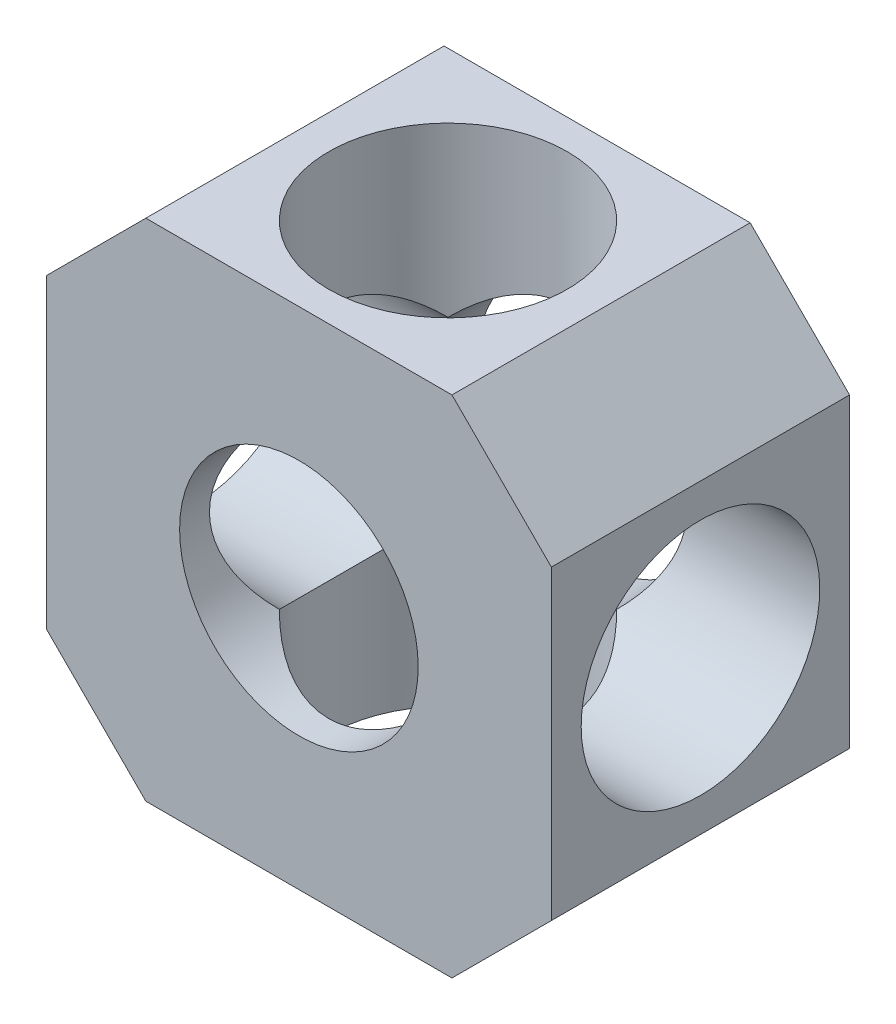
ISO-10303-21;
HEADER;
FILE_DESCRIPTION(('STEP AP214'),'2;1');
FILE_NAME('part.step','',(''),(''),'','','');
FILE_SCHEMA(('AUTOMOTIVE_DESIGN { 1 0 10303 214 1 1 1 1 }'));
ENDSEC;
DATA;
#1=APPLICATION_CONTEXT('core data for automotive mechanical design processes');
#2=APPLICATION_PROTOCOL_DEFINITION('international standard','automotive_design',2000,#1);
#3=PRODUCT_CONTEXT('',#1,'mechanical');
#4=PRODUCT('Part','Part','',(#3));
#5=PRODUCT_RELATED_PRODUCT_CATEGORY('part','',(#4));
#6=PRODUCT_DEFINITION_FORMATION('','',#4);
#7=PRODUCT_DEFINITION_CONTEXT('part definition',#1,'design');
#8=PRODUCT_DEFINITION('design','',#6,#7);
#9=PRODUCT_DEFINITION_SHAPE('','',#8);
#10=(LENGTH_UNIT() NAMED_UNIT(*) SI_UNIT(.MILLI.,.METRE.));
#11=(NAMED_UNIT(*) PLANE_ANGLE_UNIT() SI_UNIT($,.RADIAN.));
#12=(NAMED_UNIT(*) SI_UNIT($,.STERADIAN.) SOLID_ANGLE_UNIT());
#13=UNCERTAINTY_MEASURE_WITH_UNIT(LENGTH_MEASURE(1.E-05),#10,'distance_accuracy_value','');
#14=(GEOMETRIC_REPRESENTATION_CONTEXT(3) GLOBAL_UNCERTAINTY_ASSIGNED_CONTEXT((#13)) GLOBAL_UNIT_ASSIGNED_CONTEXT((#10,
#11,#12)) REPRESENTATION_CONTEXT('',''));
#15=CARTESIAN_POINT('',(0.,0.,0.));
#16=DIRECTION('',(0.,0.,1.));
#17=DIRECTION('',(1.,0.,0.));
#18=AXIS2_PLACEMENT_3D('',#15,#16,#17);
#19=CARTESIAN_POINT('',(0.,0.,7.5));
#20=DIRECTION('',(0.,0.,-1.));
#21=DIRECTION('',(-1.,0.,0.));
#22=AXIS2_PLACEMENT_3D('',#19,#20,#21);
#23=CYLINDRICAL_SURFACE('',#22,6.);
#24=CARTESIAN_POINT('',(0.,0.,-7.5));
#25=DIRECTION('',(0.,0.,-1.));
#26=DIRECTION('',(-1.,0.,0.));
#27=AXIS2_PLACEMENT_3D('',#24,#25,#26);
#28=CIRCLE('',#27,6.);
#29=CARTESIAN_POINT('',(-6.,0.,-7.5));
#30=VERTEX_POINT('',#29);
#31=EDGE_CURVE('E214',#30,#30,#28,.T.);
#32=ORIENTED_EDGE('',*,*,#31,.T.);
#33=EDGE_LOOP('',(#32));
#34=FACE_BOUND('',#33,.T.);
#35=CARTESIAN_POINT('',(0.,0.,0.));
#36=DIRECTION('',(0.,0.707106781186547,-0.707106781186547));
#37=DIRECTION('',(0.,-0.707106781186547,-0.707106781186547));
#38=AXIS2_PLACEMENT_3D('',#35,#36,#37);
#39=ELLIPSE('',#38,8.48528137423857,6.);
#40=CARTESIAN_POINT('',(-4.24264068711927,-4.24264068711931,-4.2426406871193));
#41=VERTEX_POINT('',#40);
#42=CARTESIAN_POINT('',(4.24264068711929,-4.24264068711928,-4.24264068711928));
#43=VERTEX_POINT('',#42);
#44=EDGE_CURVE('E131',#41,#43,#39,.F.);
#45=ORIENTED_EDGE('',*,*,#44,.T.);
#46=CARTESIAN_POINT('',(0.,0.,0.));
#47=DIRECTION('',(-0.707106781186547,0.,-0.707106781186547));
#48=DIRECTION('',(0.707106781186547,0.,-0.707106781186547));
#49=AXIS2_PLACEMENT_3D('',#46,#47,#48);
#50=ELLIPSE('',#49,8.48528137423857,6.);
#51=CARTESIAN_POINT('',(4.24264068711927,4.24264068711931,-4.2426406871193));
#52=VERTEX_POINT('',#51);
#53=EDGE_CURVE('E60',#43,#52,#50,.F.);
#54=ORIENTED_EDGE('',*,*,#53,.T.);
#55=CARTESIAN_POINT('',(0.,0.,0.));
#56=DIRECTION('',(0.,-0.707106781186547,-0.707106781186547));
#57=DIRECTION('',(0.,0.707106781186547,-0.707106781186547));
#58=AXIS2_PLACEMENT_3D('',#55,#56,#57);
#59=ELLIPSE('',#58,8.48528137423857,6.);
#60=CARTESIAN_POINT('',(-4.2426406871193,4.24264068711926,-4.24264068711927));
#61=VERTEX_POINT('',#60);
#62=EDGE_CURVE('E140',#52,#61,#59,.F.);
#63=ORIENTED_EDGE('',*,*,#62,.T.);
#64=CARTESIAN_POINT('',(0.,0.,0.));
#65=DIRECTION('',(0.707106781186547,0.,-0.707106781186547));
#66=DIRECTION('',(-0.707106781186547,0.,-0.707106781186547));
#67=AXIS2_PLACEMENT_3D('',#64,#65,#66);
#68=ELLIPSE('',#67,8.48528137423857,6.);
#69=EDGE_CURVE('E129',#61,#41,#68,.F.);
#70=ORIENTED_EDGE('',*,*,#69,.T.);
#71=EDGE_LOOP('',(#45,#54,#63,#70));
#72=FACE_BOUND('',#71,.T.);
#73=ADVANCED_FACE('F41',(#34,#72),#23,.F.);
#74=CARTESIAN_POINT('',(12.7,-12.7,7.5));
#75=DIRECTION('',(-1.,0.,0.));
#76=DIRECTION('',(0.,0.,1.));
#77=AXIS2_PLACEMENT_3D('',#74,#75,#76);
#78=PLANE('',#77);
#79=CARTESIAN_POINT('',(12.7,0.,0.));
#80=DIRECTION('',(-1.,0.,0.));
#81=DIRECTION('',(0.,0.,1.));
#82=AXIS2_PLACEMENT_3D('',#79,#80,#81);
#83=CIRCLE('',#82,6.);
#84=CARTESIAN_POINT('',(12.7,0.,6.));
#85=VERTEX_POINT('',#84);
#86=EDGE_CURVE('E229',#85,#85,#83,.T.);
#87=ORIENTED_EDGE('',*,*,#86,.T.);
#88=EDGE_LOOP('',(#87));
#89=FACE_BOUND('',#88,.T.);
#90=DIRECTION('',(0.,1.,0.));
#91=VECTOR('',#90,1.);
#92=CARTESIAN_POINT('',(12.7,-12.7,7.5));
#93=LINE('',#92,#91);
#94=CARTESIAN_POINT('',(12.7,-7.7,7.5));
#95=VERTEX_POINT('',#94);
#96=CARTESIAN_POINT('',(12.7,7.69999999999999,7.5));
#97=VERTEX_POINT('',#96);
#98=EDGE_CURVE('E193',#95,#97,#93,.T.);
#99=ORIENTED_EDGE('',*,*,#98,.F.);
#100=DIRECTION('',(0.,0.,-1.));
#101=VECTOR('',#100,1.);
#102=CARTESIAN_POINT('',(12.7,-7.7,7.5));
#103=LINE('',#102,#101);
#104=CARTESIAN_POINT('',(12.7,-7.7,-7.5));
#105=VERTEX_POINT('',#104);
#106=EDGE_CURVE('E152',#95,#105,#103,.T.);
#107=ORIENTED_EDGE('',*,*,#106,.T.);
#108=DIRECTION('',(0.,1.,0.));
#109=VECTOR('',#108,1.);
#110=CARTESIAN_POINT('',(12.7,-12.7,-7.5));
#111=LINE('',#110,#109);
#112=CARTESIAN_POINT('',(12.7,7.69999999999999,-7.5));
#113=VERTEX_POINT('',#112);
#114=EDGE_CURVE('E203',#105,#113,#111,.T.);
#115=ORIENTED_EDGE('',*,*,#114,.T.);
#116=DIRECTION('',(0.,0.,1.));
#117=VECTOR('',#116,1.);
#118=CARTESIAN_POINT('',(12.7,7.69999999999999,7.5));
#119=LINE('',#118,#117);
#120=EDGE_CURVE('E160',#113,#97,#119,.T.);
#121=ORIENTED_EDGE('',*,*,#120,.T.);
#122=EDGE_LOOP('',(#99,#107,#115,#121));
#123=FACE_BOUND('',#122,.T.);
#124=ADVANCED_FACE('F258',(#89,#123),#78,.F.);
#125=CARTESIAN_POINT('',(-12.7,12.7,7.5));
#126=DIRECTION('',(0.,-1.,0.));
#127=DIRECTION('',(0.,0.,-1.));
#128=AXIS2_PLACEMENT_3D('',#125,#126,#127);
#129=PLANE('',#128);
#130=CARTESIAN_POINT('',(0.,12.7,0.));
#131=DIRECTION('',(0.,1.,0.));
#132=DIRECTION('',(0.,0.,1.));
#133=AXIS2_PLACEMENT_3D('',#130,#131,#132);
#134=CIRCLE('',#133,6.);
#135=CARTESIAN_POINT('',(0.,12.7,6.));
#136=VERTEX_POINT('',#135);
#137=EDGE_CURVE('E224',#136,#136,#134,.T.);
#138=ORIENTED_EDGE('',*,*,#137,.F.);
#139=EDGE_LOOP('',(#138));
#140=FACE_BOUND('',#139,.T.);
#141=DIRECTION('',(-1.,0.,0.));
#142=VECTOR('',#141,1.);
#143=CARTESIAN_POINT('',(-12.7,12.7,-7.5));
#144=LINE('',#143,#142);
#145=CARTESIAN_POINT('',(7.7,12.7,-7.5));
#146=VERTEX_POINT('',#145);
#147=CARTESIAN_POINT('',(-7.69999999999999,12.7,-7.5));
#148=VERTEX_POINT('',#147);
#149=EDGE_CURVE('E196',#146,#148,#144,.T.);
#150=ORIENTED_EDGE('',*,*,#149,.T.);
#151=DIRECTION('',(0.,0.,1.));
#152=VECTOR('',#151,1.);
#153=CARTESIAN_POINT('',(-7.69999999999999,12.7,7.5));
#154=LINE('',#153,#152);
#155=CARTESIAN_POINT('',(-7.69999999999999,12.7,7.5));
#156=VERTEX_POINT('',#155);
#157=EDGE_CURVE('E157',#148,#156,#154,.T.);
#158=ORIENTED_EDGE('',*,*,#157,.T.);
#159=DIRECTION('',(-1.,0.,0.));
#160=VECTOR('',#159,1.);
#161=CARTESIAN_POINT('',(-12.7,12.7,7.5));
#162=LINE('',#161,#160);
#163=CARTESIAN_POINT('',(7.7,12.7,7.5));
#164=VERTEX_POINT('',#163);
#165=EDGE_CURVE('E209',#164,#156,#162,.T.);
#166=ORIENTED_EDGE('',*,*,#165,.F.);
#167=DIRECTION('',(0.,0.,-1.));
#168=VECTOR('',#167,1.);
#169=CARTESIAN_POINT('',(7.70000000000001,12.7,7.5));
#170=LINE('',#169,#168);
#171=EDGE_CURVE('E161',#164,#146,#170,.T.);
#172=ORIENTED_EDGE('',*,*,#171,.T.);
#173=EDGE_LOOP('',(#150,#158,#166,#172));
#174=FACE_BOUND('',#173,.T.);
#175=ADVANCED_FACE('F263',(#140,#174),#129,.F.);
#176=CARTESIAN_POINT('',(-12.7,-12.7,7.5));
#177=DIRECTION('',(1.,0.,0.));
#178=DIRECTION('',(0.,0.,-1.));
#179=AXIS2_PLACEMENT_3D('',#176,#177,#178);
#180=PLANE('',#179);
#181=CARTESIAN_POINT('',(-12.7,0.,0.));
#182=DIRECTION('',(1.,0.,0.));
#183=DIRECTION('',(0.,0.,-1.));
#184=AXIS2_PLACEMENT_3D('',#181,#182,#183);
#185=CIRCLE('',#184,6.);
#186=CARTESIAN_POINT('',(-12.7,0.,-6.));
#187=VERTEX_POINT('',#186);
#188=EDGE_CURVE('E142',#187,#187,#185,.T.);
#189=ORIENTED_EDGE('',*,*,#188,.T.);
#190=EDGE_LOOP('',(#189));
#191=FACE_BOUND('',#190,.T.);
#192=DIRECTION('',(0.,-1.,0.));
#193=VECTOR('',#192,1.);
#194=CARTESIAN_POINT('',(-12.7,-12.7,-7.5));
#195=LINE('',#194,#193);
#196=CARTESIAN_POINT('',(-12.7,7.70000000000001,-7.5));
#197=VERTEX_POINT('',#196);
#198=CARTESIAN_POINT('',(-12.7,-7.69999999999998,-7.5));
#199=VERTEX_POINT('',#198);
#200=EDGE_CURVE('E195',#197,#199,#195,.T.);
#201=ORIENTED_EDGE('',*,*,#200,.T.);
#202=DIRECTION('',(0.,0.,1.));
#203=VECTOR('',#202,1.);
#204=CARTESIAN_POINT('',(-12.7,-7.69999999999998,7.5));
#205=LINE('',#204,#203);
#206=CARTESIAN_POINT('',(-12.7,-7.69999999999998,7.5));
#207=VERTEX_POINT('',#206);
#208=EDGE_CURVE('E174',#199,#207,#205,.T.);
#209=ORIENTED_EDGE('',*,*,#208,.T.);
#210=DIRECTION('',(0.,-1.,0.));
#211=VECTOR('',#210,1.);
#212=CARTESIAN_POINT('',(-12.7,-12.7,7.5));
#213=LINE('',#212,#211);
#214=CARTESIAN_POINT('',(-12.7,7.70000000000001,7.5));
#215=VERTEX_POINT('',#214);
#216=EDGE_CURVE('E210',#215,#207,#213,.T.);
#217=ORIENTED_EDGE('',*,*,#216,.F.);
#218=DIRECTION('',(0.,0.,-1.));
#219=VECTOR('',#218,1.);
#220=CARTESIAN_POINT('',(-12.7,7.70000000000001,7.5));
#221=LINE('',#220,#219);
#222=EDGE_CURVE('E175',#215,#197,#221,.T.);
#223=ORIENTED_EDGE('',*,*,#222,.T.);
#224=EDGE_LOOP('',(#201,#209,#217,#223));
#225=FACE_BOUND('',#224,.T.);
#226=ADVANCED_FACE('F297',(#191,#225),#180,.F.);
#227=CARTESIAN_POINT('',(-12.7,-12.7,7.5));
#228=DIRECTION('',(0.,1.,0.));
#229=DIRECTION('',(0.,0.,1.));
#230=AXIS2_PLACEMENT_3D('',#227,#228,#229);
#231=PLANE('',#230);
#232=CARTESIAN_POINT('',(0.,-12.7,0.));
#233=DIRECTION('',(0.,1.,0.));
#234=DIRECTION('',(0.,0.,1.));
#235=AXIS2_PLACEMENT_3D('',#232,#233,#234);
#236=CIRCLE('',#235,6.);
#237=CARTESIAN_POINT('',(0.,-12.7,6.));
#238=VERTEX_POINT('',#237);
#239=EDGE_CURVE('E217',#238,#238,#236,.T.);
#240=ORIENTED_EDGE('',*,*,#239,.T.);
#241=EDGE_LOOP('',(#240));
#242=FACE_BOUND('',#241,.T.);
#243=DIRECTION('',(1.,0.,0.));
#244=VECTOR('',#243,1.);
#245=CARTESIAN_POINT('',(-12.7,-12.7,7.5));
#246=LINE('',#245,#244);
#247=CARTESIAN_POINT('',(-7.7,-12.7,7.5));
#248=VERTEX_POINT('',#247);
#249=CARTESIAN_POINT('',(7.69999999999998,-12.7,7.5));
#250=VERTEX_POINT('',#249);
#251=EDGE_CURVE('E186',#248,#250,#246,.T.);
#252=ORIENTED_EDGE('',*,*,#251,.F.);
#253=DIRECTION('',(0.,0.,-1.));
#254=VECTOR('',#253,1.);
#255=CARTESIAN_POINT('',(-7.7,-12.7,7.5));
#256=LINE('',#255,#254);
#257=CARTESIAN_POINT('',(-7.7,-12.7,-7.5));
#258=VERTEX_POINT('',#257);
#259=EDGE_CURVE('E183',#248,#258,#256,.T.);
#260=ORIENTED_EDGE('',*,*,#259,.T.);
#261=DIRECTION('',(1.,0.,0.));
#262=VECTOR('',#261,1.);
#263=CARTESIAN_POINT('',(-12.7,-12.7,-7.5));
#264=LINE('',#263,#262);
#265=CARTESIAN_POINT('',(7.69999999999998,-12.7,-7.5));
#266=VERTEX_POINT('',#265);
#267=EDGE_CURVE('E191',#258,#266,#264,.T.);
#268=ORIENTED_EDGE('',*,*,#267,.T.);
#269=DIRECTION('',(0.,0.,1.));
#270=VECTOR('',#269,1.);
#271=CARTESIAN_POINT('',(7.69999999999999,-12.7,7.5));
#272=LINE('',#271,#270);
#273=EDGE_CURVE('E187',#266,#250,#272,.T.);
#274=ORIENTED_EDGE('',*,*,#273,.T.);
#275=EDGE_LOOP('',(#252,#260,#268,#274));
#276=FACE_BOUND('',#275,.T.);
#277=ADVANCED_FACE('F307',(#242,#276),#231,.F.);
#278=CARTESIAN_POINT('',(0.,0.,7.5));
#279=DIRECTION('',(0.,0.,-1.));
#280=DIRECTION('',(-1.,0.,0.));
#281=AXIS2_PLACEMENT_3D('',#278,#279,#280);
#282=PLANE('',#281);
#283=CARTESIAN_POINT('',(0.,0.,7.5));
#284=DIRECTION('',(0.,0.,-1.));
#285=DIRECTION('',(-1.,0.,0.));
#286=AXIS2_PLACEMENT_3D('',#283,#284,#285);
#287=CIRCLE('',#286,6.);
#288=CARTESIAN_POINT('',(-6.,0.,7.5));
#289=VERTEX_POINT('',#288);
#290=EDGE_CURVE('E204',#289,#289,#287,.T.);
#291=ORIENTED_EDGE('',*,*,#290,.T.);
#292=EDGE_LOOP('',(#291));
#293=FACE_BOUND('',#292,.T.);
#294=ORIENTED_EDGE('',*,*,#216,.T.);
#295=DIRECTION('',(-0.707106781186546,0.707106781186549,0.));
#296=VECTOR('',#295,1.);
#297=CARTESIAN_POINT('',(-7.7,-12.7,7.5));
#298=LINE('',#297,#296);
#299=EDGE_CURVE('E163',#207,#248,#298,.F.);
#300=ORIENTED_EDGE('',*,*,#299,.T.);
#301=ORIENTED_EDGE('',*,*,#251,.T.);
#302=DIRECTION('',(-0.707106781186549,-0.707106781186546,0.));
#303=VECTOR('',#302,1.);
#304=CARTESIAN_POINT('',(12.7,-7.7,7.5));
#305=LINE('',#304,#303);
#306=EDGE_CURVE('E169',#250,#95,#305,.F.);
#307=ORIENTED_EDGE('',*,*,#306,.T.);
#308=ORIENTED_EDGE('',*,*,#98,.T.);
#309=DIRECTION('',(0.707106781186546,-0.707106781186549,0.));
#310=VECTOR('',#309,1.);
#311=CARTESIAN_POINT('',(7.70000000000001,12.7,7.5));
#312=LINE('',#311,#310);
#313=EDGE_CURVE('E168',#97,#164,#312,.F.);
#314=ORIENTED_EDGE('',*,*,#313,.T.);
#315=ORIENTED_EDGE('',*,*,#165,.T.);
#316=DIRECTION('',(0.707106781186549,0.707106781186546,0.));
#317=VECTOR('',#316,1.);
#318=CARTESIAN_POINT('',(-12.7,7.70000000000001,7.5));
#319=LINE('',#318,#317);
#320=EDGE_CURVE('E167',#156,#215,#319,.F.);
#321=ORIENTED_EDGE('',*,*,#320,.T.);
#322=EDGE_LOOP('',(#294,#300,#301,#307,#308,#314,#315,#321));
#323=FACE_BOUND('',#322,.T.);
#324=ADVANCED_FACE('F287',(#293,#323),#282,.F.);
#325=CARTESIAN_POINT('',(0.,0.,-7.5));
#326=DIRECTION('',(0.,0.,-1.));
#327=DIRECTION('',(-1.,0.,0.));
#328=AXIS2_PLACEMENT_3D('',#325,#326,#327);
#329=PLANE('',#328);
#330=ORIENTED_EDGE('',*,*,#31,.F.);
#331=EDGE_LOOP('',(#330));
#332=FACE_BOUND('',#331,.T.);
#333=ORIENTED_EDGE('',*,*,#267,.F.);
#334=DIRECTION('',(0.707106781186546,-0.707106781186549,0.));
#335=VECTOR('',#334,1.);
#336=CARTESIAN_POINT('',(-10.2,-10.2,-7.5));
#337=LINE('',#336,#335);
#338=EDGE_CURVE('E177',#258,#199,#337,.F.);
#339=ORIENTED_EDGE('',*,*,#338,.T.);
#340=ORIENTED_EDGE('',*,*,#200,.F.);
#341=DIRECTION('',(-0.707106781186549,-0.707106781186546,0.));
#342=VECTOR('',#341,1.);
#343=CARTESIAN_POINT('',(-10.2,10.2,-7.5));
#344=LINE('',#343,#342);
#345=EDGE_CURVE('E178',#197,#148,#344,.F.);
#346=ORIENTED_EDGE('',*,*,#345,.T.);
#347=ORIENTED_EDGE('',*,*,#149,.F.);
#348=DIRECTION('',(-0.707106781186546,0.707106781186549,0.));
#349=VECTOR('',#348,1.);
#350=CARTESIAN_POINT('',(10.2,10.2,-7.5));
#351=LINE('',#350,#349);
#352=EDGE_CURVE('E181',#146,#113,#351,.F.);
#353=ORIENTED_EDGE('',*,*,#352,.T.);
#354=ORIENTED_EDGE('',*,*,#114,.F.);
#355=DIRECTION('',(0.707106781186549,0.707106781186546,0.));
#356=VECTOR('',#355,1.);
#357=CARTESIAN_POINT('',(10.2,-10.2,-7.5));
#358=LINE('',#357,#356);
#359=EDGE_CURVE('E182',#105,#266,#358,.F.);
#360=ORIENTED_EDGE('',*,*,#359,.T.);
#361=EDGE_LOOP('',(#333,#339,#340,#346,#347,#353,#354,#360));
#362=FACE_BOUND('',#361,.T.);
#363=ADVANCED_FACE('F314',(#332,#362),#329,.T.);
#364=CARTESIAN_POINT('',(-7.7,-12.7,7.5));
#365=DIRECTION('',(0.707106781186549,0.707106781186546,0.));
#366=DIRECTION('',(0.,0.,-1.));
#367=AXIS2_PLACEMENT_3D('',#364,#365,#366);
#368=PLANE('',#367);
#369=ORIENTED_EDGE('',*,*,#299,.F.);
#370=ORIENTED_EDGE('',*,*,#208,.F.);
#371=ORIENTED_EDGE('',*,*,#338,.F.);
#372=ORIENTED_EDGE('',*,*,#259,.F.);
#373=EDGE_LOOP('',(#369,#370,#371,#372));
#374=FACE_BOUND('',#373,.T.);
#375=ADVANCED_FACE('F302',(#374),#368,.F.);
#376=CARTESIAN_POINT('',(-12.7,7.70000000000001,7.5));
#377=DIRECTION('',(0.707106781186546,-0.707106781186549,0.));
#378=DIRECTION('',(0.,0.,-1.));
#379=AXIS2_PLACEMENT_3D('',#376,#377,#378);
#380=PLANE('',#379);
#381=ORIENTED_EDGE('',*,*,#320,.F.);
#382=ORIENTED_EDGE('',*,*,#157,.F.);
#383=ORIENTED_EDGE('',*,*,#345,.F.);
#384=ORIENTED_EDGE('',*,*,#222,.F.);
#385=EDGE_LOOP('',(#381,#382,#383,#384));
#386=FACE_BOUND('',#385,.T.);
#387=ADVANCED_FACE('F278',(#386),#380,.F.);
#388=CARTESIAN_POINT('',(12.7,-7.7,7.5));
#389=DIRECTION('',(-0.707106781186546,0.707106781186549,0.));
#390=DIRECTION('',(0.,0.,-1.));
#391=AXIS2_PLACEMENT_3D('',#388,#389,#390);
#392=PLANE('',#391);
#393=ORIENTED_EDGE('',*,*,#306,.F.);
#394=ORIENTED_EDGE('',*,*,#273,.F.);
#395=ORIENTED_EDGE('',*,*,#359,.F.);
#396=ORIENTED_EDGE('',*,*,#106,.F.);
#397=EDGE_LOOP('',(#393,#394,#395,#396));
#398=FACE_BOUND('',#397,.T.);
#399=ADVANCED_FACE('F273',(#398),#392,.F.);
#400=CARTESIAN_POINT('',(7.70000000000001,12.7,7.5));
#401=DIRECTION('',(-0.707106781186549,-0.707106781186546,0.));
#402=DIRECTION('',(0.,0.,-1.));
#403=AXIS2_PLACEMENT_3D('',#400,#401,#402);
#404=PLANE('',#403);
#405=ORIENTED_EDGE('',*,*,#313,.F.);
#406=ORIENTED_EDGE('',*,*,#120,.F.);
#407=ORIENTED_EDGE('',*,*,#352,.F.);
#408=ORIENTED_EDGE('',*,*,#171,.F.);
#409=EDGE_LOOP('',(#405,#406,#407,#408));
#410=FACE_BOUND('',#409,.T.);
#411=ADVANCED_FACE('F42',(#410),#404,.F.);
#412=CARTESIAN_POINT('',(0.,0.,0.));
#413=DIRECTION('',(0.,0.707106781186547,-0.707106781186547));
#414=DIRECTION('',(0.,-0.707106781186547,-0.707106781186547));
#415=AXIS2_PLACEMENT_3D('',#412,#413,#414);
#416=ELLIPSE('',#415,8.48528137423857,6.);
#417=CARTESIAN_POINT('',(-4.2426406871193,4.24264068711926,4.24264068711927));
#418=VERTEX_POINT('',#417);
#419=CARTESIAN_POINT('',(4.24264068711927,4.24264068711931,4.2426406871193));
#420=VERTEX_POINT('',#419);
#421=EDGE_CURVE('E148',#418,#420,#416,.T.);
#422=ORIENTED_EDGE('',*,*,#421,.T.);
#423=CARTESIAN_POINT('',(0.,0.,0.));
#424=DIRECTION('',(0.707106781186547,0.,-0.707106781186547));
#425=DIRECTION('',(-0.707106781186547,0.,-0.707106781186547));
#426=AXIS2_PLACEMENT_3D('',#423,#424,#425);
#427=ELLIPSE('',#426,8.48528137423857,6.);
#428=CARTESIAN_POINT('',(4.2426406871193,-4.24264068711926,4.24264068711927));
#429=VERTEX_POINT('',#428);
#430=EDGE_CURVE('E143',#420,#429,#427,.T.);
#431=ORIENTED_EDGE('',*,*,#430,.T.);
#432=CARTESIAN_POINT('',(0.,0.,0.));
#433=DIRECTION('',(0.,-0.707106781186547,-0.707106781186547));
#434=DIRECTION('',(0.,0.707106781186547,-0.707106781186547));
#435=AXIS2_PLACEMENT_3D('',#432,#433,#434);
#436=ELLIPSE('',#435,8.48528137423857,6.);
#437=CARTESIAN_POINT('',(-4.24264068711928,-4.24264068711929,4.24264068711929));
#438=VERTEX_POINT('',#437);
#439=EDGE_CURVE('E149',#429,#438,#436,.T.);
#440=ORIENTED_EDGE('',*,*,#439,.T.);
#441=CARTESIAN_POINT('',(0.,0.,0.));
#442=DIRECTION('',(-0.707106781186547,0.,-0.707106781186547));
#443=DIRECTION('',(0.707106781186547,0.,-0.707106781186547));
#444=AXIS2_PLACEMENT_3D('',#441,#442,#443);
#445=ELLIPSE('',#444,8.48528137423857,6.);
#446=EDGE_CURVE('E65',#438,#418,#445,.T.);
#447=ORIENTED_EDGE('',*,*,#446,.T.);
#448=EDGE_LOOP('',(#422,#431,#440,#447));
#449=FACE_BOUND('',#448,.T.);
#450=ORIENTED_EDGE('',*,*,#290,.F.);
#451=EDGE_LOOP('',(#450));
#452=FACE_BOUND('',#451,.T.);
#453=ADVANCED_FACE('F242',(#449,#452),#23,.F.);
#454=CARTESIAN_POINT('',(0.,-15.3,0.));
#455=DIRECTION('',(0.,1.,0.));
#456=DIRECTION('',(0.,0.,1.));
#457=AXIS2_PLACEMENT_3D('',#454,#455,#456);
#458=CYLINDRICAL_SURFACE('',#457,6.);
#459=ORIENTED_EDGE('',*,*,#137,.T.);
#460=EDGE_LOOP('',(#459));
#461=FACE_BOUND('',#460,.T.);
#462=ORIENTED_EDGE('',*,*,#62,.F.);
#463=CARTESIAN_POINT('',(0.,0.,0.));
#464=DIRECTION('',(0.707106781186551,-0.707106781186544,0.));
#465=DIRECTION('',(-0.707106781186544,-0.707106781186551,0.));
#466=AXIS2_PLACEMENT_3D('',#463,#464,#465);
#467=ELLIPSE('',#466,8.48528137423862,6.);
#468=EDGE_CURVE('E235',#52,#420,#467,.T.);
#469=ORIENTED_EDGE('',*,*,#468,.T.);
#470=ORIENTED_EDGE('',*,*,#421,.F.);
#471=CARTESIAN_POINT('',(0.,0.,0.));
#472=DIRECTION('',(-0.707106781186544,-0.707106781186551,0.));
#473=DIRECTION('',(0.707106781186551,-0.707106781186544,0.));
#474=AXIS2_PLACEMENT_3D('',#471,#472,#473);
#475=ELLIPSE('',#474,8.48528137423853,6.);
#476=EDGE_CURVE('E236',#418,#61,#475,.T.);
#477=ORIENTED_EDGE('',*,*,#476,.T.);
#478=EDGE_LOOP('',(#462,#469,#470,#477));
#479=FACE_BOUND('',#478,.T.);
#480=ADVANCED_FACE('F243',(#461,#479),#458,.F.);
#481=ORIENTED_EDGE('',*,*,#439,.F.);
#482=CARTESIAN_POINT('',(0.,0.,0.));
#483=DIRECTION('',(0.707106781186546,0.707106781186549,0.));
#484=DIRECTION('',(-0.707106781186549,0.707106781186546,0.));
#485=AXIS2_PLACEMENT_3D('',#482,#483,#484);
#486=ELLIPSE('',#485,8.48528137423856,6.);
#487=EDGE_CURVE('E11',#429,#43,#486,.T.);
#488=ORIENTED_EDGE('',*,*,#487,.T.);
#489=ORIENTED_EDGE('',*,*,#44,.F.);
#490=CARTESIAN_POINT('',(0.,0.,0.));
#491=DIRECTION('',(-0.707106781186549,0.707106781186546,0.));
#492=DIRECTION('',(0.707106781186546,0.707106781186549,0.));
#493=AXIS2_PLACEMENT_3D('',#490,#491,#492);
#494=ELLIPSE('',#493,8.48528137423859,6.);
#495=EDGE_CURVE('E49',#41,#438,#494,.T.);
#496=ORIENTED_EDGE('',*,*,#495,.T.);
#497=EDGE_LOOP('',(#481,#488,#489,#496));
#498=FACE_BOUND('',#497,.T.);
#499=ORIENTED_EDGE('',*,*,#239,.F.);
#500=EDGE_LOOP('',(#499));
#501=FACE_BOUND('',#500,.T.);
#502=ADVANCED_FACE('F145',(#498,#501),#458,.F.);
#503=CARTESIAN_POINT('',(15.3,0.,0.));
#504=DIRECTION('',(-1.,0.,0.));
#505=DIRECTION('',(0.,-1.,0.));
#506=AXIS2_PLACEMENT_3D('',#503,#504,#505);
#507=CYLINDRICAL_SURFACE('',#506,6.);
#508=ORIENTED_EDGE('',*,*,#188,.F.);
#509=EDGE_LOOP('',(#508));
#510=FACE_BOUND('',#509,.T.);
#511=ORIENTED_EDGE('',*,*,#476,.F.);
#512=ORIENTED_EDGE('',*,*,#446,.F.);
#513=ORIENTED_EDGE('',*,*,#495,.F.);
#514=ORIENTED_EDGE('',*,*,#69,.F.);
#515=EDGE_LOOP('',(#511,#512,#513,#514));
#516=FACE_BOUND('',#515,.T.);
#517=ADVANCED_FACE('F126',(#510,#516),#507,.F.);
#518=ORIENTED_EDGE('',*,*,#86,.F.);
#519=EDGE_LOOP('',(#518));
#520=FACE_BOUND('',#519,.T.);
#521=ORIENTED_EDGE('',*,*,#487,.F.);
#522=ORIENTED_EDGE('',*,*,#430,.F.);
#523=ORIENTED_EDGE('',*,*,#468,.F.);
#524=ORIENTED_EDGE('',*,*,#53,.F.);
#525=EDGE_LOOP('',(#521,#522,#523,#524));
#526=FACE_BOUND('',#525,.T.);
#527=ADVANCED_FACE('F241',(#520,#526),#507,.F.);
#528=CLOSED_SHELL('',(#73,#124,#175,#226,#277,#324,#363,#375,#387,#399,#411,#453,#480,#502,#517,#527));
#529=MANIFOLD_SOLID_BREP('B2',#528);
#530=ADVANCED_BREP_SHAPE_REPRESENTATION('',(#18,#529),#14);
#531=SHAPE_DEFINITION_REPRESENTATION(#9,#530);
ENDSEC;
END-ISO-10303-21;
